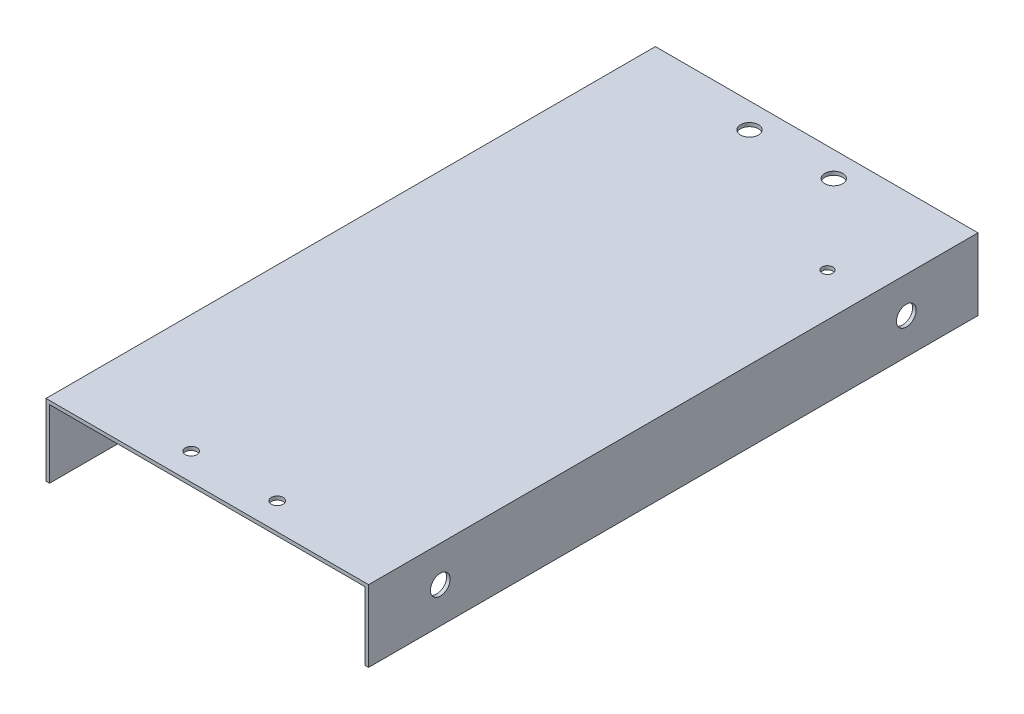
ISO-10303-21;
HEADER;
FILE_DESCRIPTION(('STEP AP214'),'2;1');
FILE_NAME('part.step','',(''),(''),'','','');
FILE_SCHEMA(('AUTOMOTIVE_DESIGN { 1 0 10303 214 1 1 1 1 }'));
ENDSEC;
DATA;
#1=APPLICATION_CONTEXT('core data for automotive mechanical design processes');
#2=APPLICATION_PROTOCOL_DEFINITION('international standard','automotive_design',2000,#1);
#3=PRODUCT_CONTEXT('',#1,'mechanical');
#4=PRODUCT('Part','Part','',(#3));
#5=PRODUCT_RELATED_PRODUCT_CATEGORY('part','',(#4));
#6=PRODUCT_DEFINITION_FORMATION('','',#4);
#7=PRODUCT_DEFINITION_CONTEXT('part definition',#1,'design');
#8=PRODUCT_DEFINITION('design','',#6,#7);
#9=PRODUCT_DEFINITION_SHAPE('','',#8);
#10=(LENGTH_UNIT() NAMED_UNIT(*) SI_UNIT(.MILLI.,.METRE.));
#11=(NAMED_UNIT(*) PLANE_ANGLE_UNIT() SI_UNIT($,.RADIAN.));
#12=(NAMED_UNIT(*) SI_UNIT($,.STERADIAN.) SOLID_ANGLE_UNIT());
#13=UNCERTAINTY_MEASURE_WITH_UNIT(LENGTH_MEASURE(1.E-05),#10,'distance_accuracy_value','');
#14=(GEOMETRIC_REPRESENTATION_CONTEXT(3) GLOBAL_UNCERTAINTY_ASSIGNED_CONTEXT((#13)) GLOBAL_UNIT_ASSIGNED_CONTEXT((#10,
#11,#12)) REPRESENTATION_CONTEXT('',''));
#15=CARTESIAN_POINT('',(0.,0.,0.));
#16=DIRECTION('',(0.,0.,1.));
#17=DIRECTION('',(1.,0.,0.));
#18=AXIS2_PLACEMENT_3D('',#15,#16,#17);
#19=CARTESIAN_POINT('',(-44.,0.999999999999997,-170.));
#20=DIRECTION('',(0.,-1.,0.));
#21=DIRECTION('',(0.,0.,-1.));
#22=AXIS2_PLACEMENT_3D('',#19,#20,#21);
#23=PLANE('',#22);
#24=DIRECTION('',(1.,0.,0.));
#25=VECTOR('',#24,1.);
#26=CARTESIAN_POINT('',(-44.,0.999999999999997,0.));
#27=LINE('',#26,#25);
#28=CARTESIAN_POINT('',(-45.,0.999999999999997,0.));
#29=VERTEX_POINT('',#28);
#30=CARTESIAN_POINT('',(-44.,0.999999999999997,0.));
#31=VERTEX_POINT('',#30);
#32=EDGE_CURVE('E136',#29,#31,#27,.T.);
#33=ORIENTED_EDGE('',*,*,#32,.F.);
#34=DIRECTION('',(0.,0.,1.));
#35=VECTOR('',#34,1.);
#36=CARTESIAN_POINT('',(-45.,0.999999999999997,-170.));
#37=LINE('',#36,#35);
#38=CARTESIAN_POINT('',(-45.,0.999999999999997,-170.));
#39=VERTEX_POINT('',#38);
#40=EDGE_CURVE('E11',#39,#29,#37,.T.);
#41=ORIENTED_EDGE('',*,*,#40,.F.);
#42=DIRECTION('',(1.,0.,0.));
#43=VECTOR('',#42,1.);
#44=CARTESIAN_POINT('',(-44.,0.999999999999997,-170.));
#45=LINE('',#44,#43);
#46=CARTESIAN_POINT('',(-44.,0.999999999999997,-170.));
#47=VERTEX_POINT('',#46);
#48=EDGE_CURVE('E157',#39,#47,#45,.T.);
#49=ORIENTED_EDGE('',*,*,#48,.T.);
#50=DIRECTION('',(0.,0.,1.));
#51=VECTOR('',#50,1.);
#52=CARTESIAN_POINT('',(-44.,0.999999999999997,-170.));
#53=LINE('',#52,#51);
#54=EDGE_CURVE('E94',#47,#31,#53,.T.);
#55=ORIENTED_EDGE('',*,*,#54,.T.);
#56=EDGE_LOOP('',(#33,#41,#49,#55));
#57=FACE_BOUND('',#56,.T.);
#58=ADVANCED_FACE('F38',(#57),#23,.T.);
#59=CARTESIAN_POINT('',(-45.,0.999999999999997,-170.));
#60=DIRECTION('',(-1.,0.,0.));
#61=DIRECTION('',(0.,0.,1.));
#62=AXIS2_PLACEMENT_3D('',#59,#60,#61);
#63=PLANE('',#62);
#64=CARTESIAN_POINT('',(-45.,11.,-150.));
#65=DIRECTION('',(-1.,0.,0.));
#66=DIRECTION('',(0.,0.,1.));
#67=AXIS2_PLACEMENT_3D('',#64,#65,#66);
#68=CIRCLE('',#67,2.75000000000001);
#69=CARTESIAN_POINT('',(-45.,11.,-147.25));
#70=VERTEX_POINT('',#69);
#71=EDGE_CURVE('E196',#70,#70,#68,.T.);
#72=ORIENTED_EDGE('',*,*,#71,.F.);
#73=EDGE_LOOP('',(#72));
#74=FACE_BOUND('',#73,.T.);
#75=CARTESIAN_POINT('',(-45.,11.,-20.));
#76=DIRECTION('',(-1.,0.,0.));
#77=DIRECTION('',(0.,0.,1.));
#78=AXIS2_PLACEMENT_3D('',#75,#76,#77);
#79=CIRCLE('',#78,2.75);
#80=CARTESIAN_POINT('',(-45.,11.,-17.25));
#81=VERTEX_POINT('',#80);
#82=EDGE_CURVE('E181',#81,#81,#79,.T.);
#83=ORIENTED_EDGE('',*,*,#82,.F.);
#84=EDGE_LOOP('',(#83));
#85=FACE_BOUND('',#84,.T.);
#86=DIRECTION('',(0.,-1.,0.));
#87=VECTOR('',#86,1.);
#88=CARTESIAN_POINT('',(-45.,0.999999999999997,0.));
#89=LINE('',#88,#87);
#90=CARTESIAN_POINT('',(-45.,21.,0.));
#91=VERTEX_POINT('',#90);
#92=EDGE_CURVE('E155',#91,#29,#89,.T.);
#93=ORIENTED_EDGE('',*,*,#92,.F.);
#94=DIRECTION('',(0.,0.,1.));
#95=VECTOR('',#94,1.);
#96=CARTESIAN_POINT('',(-45.,21.,-170.));
#97=LINE('',#96,#95);
#98=CARTESIAN_POINT('',(-45.,21.,-170.));
#99=VERTEX_POINT('',#98);
#100=EDGE_CURVE('E47',#99,#91,#97,.T.);
#101=ORIENTED_EDGE('',*,*,#100,.F.);
#102=DIRECTION('',(0.,-1.,0.));
#103=VECTOR('',#102,1.);
#104=CARTESIAN_POINT('',(-45.,0.999999999999997,-170.));
#105=LINE('',#104,#103);
#106=EDGE_CURVE('E126',#99,#39,#105,.T.);
#107=ORIENTED_EDGE('',*,*,#106,.T.);
#108=ORIENTED_EDGE('',*,*,#40,.T.);
#109=EDGE_LOOP('',(#93,#101,#107,#108));
#110=FACE_BOUND('',#109,.T.);
#111=ADVANCED_FACE('F226',(#74,#85,#110),#63,.T.);
#112=CARTESIAN_POINT('',(-45.,21.,-170.));
#113=DIRECTION('',(0.,1.,0.));
#114=DIRECTION('',(0.,0.,1.));
#115=AXIS2_PLACEMENT_3D('',#112,#113,#114);
#116=PLANE('',#115);
#117=CARTESIAN_POINT('',(33.,21.,-140.));
#118=DIRECTION('',(0.,1.,0.));
#119=DIRECTION('',(0.,0.,1.));
#120=AXIS2_PLACEMENT_3D('',#117,#118,#119);
#121=CIRCLE('',#120,1.5);
#122=CARTESIAN_POINT('',(33.,21.,-138.5));
#123=VERTEX_POINT('',#122);
#124=EDGE_CURVE('E317',#123,#123,#121,.T.);
#125=ORIENTED_EDGE('',*,*,#124,.F.);
#126=EDGE_LOOP('',(#125));
#127=FACE_BOUND('',#126,.T.);
#128=CARTESIAN_POINT('',(-11.75,21.,-163.));
#129=DIRECTION('',(0.,1.,0.));
#130=DIRECTION('',(0.,0.,1.));
#131=AXIS2_PLACEMENT_3D('',#128,#129,#130);
#132=CIRCLE('',#131,2.5);
#133=CARTESIAN_POINT('',(-11.75,21.,-160.5));
#134=VERTEX_POINT('',#133);
#135=EDGE_CURVE('E188',#134,#134,#132,.T.);
#136=ORIENTED_EDGE('',*,*,#135,.F.);
#137=EDGE_LOOP('',(#136));
#138=FACE_BOUND('',#137,.T.);
#139=CARTESIAN_POINT('',(11.75,21.,-163.));
#140=DIRECTION('',(0.,1.,0.));
#141=DIRECTION('',(0.,0.,-1.));
#142=AXIS2_PLACEMENT_3D('',#139,#140,#141);
#143=CIRCLE('',#142,2.5);
#144=CARTESIAN_POINT('',(11.75,21.,-165.5));
#145=VERTEX_POINT('',#144);
#146=EDGE_CURVE('E320',#145,#145,#143,.T.);
#147=ORIENTED_EDGE('',*,*,#146,.F.);
#148=EDGE_LOOP('',(#147));
#149=FACE_BOUND('',#148,.T.);
#150=CARTESIAN_POINT('',(12.,21.,-7.5));
#151=DIRECTION('',(0.,1.,0.));
#152=DIRECTION('',(0.,0.,1.));
#153=AXIS2_PLACEMENT_3D('',#150,#151,#152);
#154=CIRCLE('',#153,1.65);
#155=CARTESIAN_POINT('',(12.,21.,-5.85));
#156=VERTEX_POINT('',#155);
#157=EDGE_CURVE('E177',#156,#156,#154,.T.);
#158=ORIENTED_EDGE('',*,*,#157,.F.);
#159=EDGE_LOOP('',(#158));
#160=FACE_BOUND('',#159,.T.);
#161=CARTESIAN_POINT('',(-12.,21.,-7.5));
#162=DIRECTION('',(0.,1.,0.));
#163=DIRECTION('',(0.,0.,-1.));
#164=AXIS2_PLACEMENT_3D('',#161,#162,#163);
#165=CIRCLE('',#164,1.65);
#166=CARTESIAN_POINT('',(-12.,21.,-9.15));
#167=VERTEX_POINT('',#166);
#168=EDGE_CURVE('E183',#167,#167,#165,.T.);
#169=ORIENTED_EDGE('',*,*,#168,.F.);
#170=EDGE_LOOP('',(#169));
#171=FACE_BOUND('',#170,.T.);
#172=DIRECTION('',(-1.,0.,0.));
#173=VECTOR('',#172,1.);
#174=CARTESIAN_POINT('',(-45.,21.,0.));
#175=LINE('',#174,#173);
#176=CARTESIAN_POINT('',(45.,21.,0.));
#177=VERTEX_POINT('',#176);
#178=EDGE_CURVE('E113',#177,#91,#175,.T.);
#179=ORIENTED_EDGE('',*,*,#178,.F.);
#180=DIRECTION('',(0.,0.,1.));
#181=VECTOR('',#180,1.);
#182=CARTESIAN_POINT('',(45.,21.,-170.));
#183=LINE('',#182,#181);
#184=CARTESIAN_POINT('',(45.,21.,-170.));
#185=VERTEX_POINT('',#184);
#186=EDGE_CURVE('E108',#185,#177,#183,.T.);
#187=ORIENTED_EDGE('',*,*,#186,.F.);
#188=DIRECTION('',(-1.,0.,0.));
#189=VECTOR('',#188,1.);
#190=CARTESIAN_POINT('',(-45.,21.,-170.));
#191=LINE('',#190,#189);
#192=EDGE_CURVE('E111',#185,#99,#191,.T.);
#193=ORIENTED_EDGE('',*,*,#192,.T.);
#194=ORIENTED_EDGE('',*,*,#100,.T.);
#195=EDGE_LOOP('',(#179,#187,#193,#194));
#196=FACE_BOUND('',#195,.T.);
#197=ADVANCED_FACE('F110',(#127,#138,#149,#160,#171,#196),#116,.T.);
#198=CARTESIAN_POINT('',(45.,21.,-170.));
#199=DIRECTION('',(1.,0.,0.));
#200=DIRECTION('',(0.,1.,0.));
#201=AXIS2_PLACEMENT_3D('',#198,#199,#200);
#202=PLANE('',#201);
#203=CARTESIAN_POINT('',(45.,11.,-150.));
#204=DIRECTION('',(-1.,0.,0.));
#205=DIRECTION('',(0.,0.,1.));
#206=AXIS2_PLACEMENT_3D('',#203,#204,#205);
#207=CIRCLE('',#206,2.75000000000001);
#208=CARTESIAN_POINT('',(45.,11.,-147.25));
#209=VERTEX_POINT('',#208);
#210=EDGE_CURVE('E172',#209,#209,#207,.T.);
#211=ORIENTED_EDGE('',*,*,#210,.T.);
#212=EDGE_LOOP('',(#211));
#213=FACE_BOUND('',#212,.T.);
#214=CARTESIAN_POINT('',(45.,11.,-20.));
#215=DIRECTION('',(-1.,0.,0.));
#216=DIRECTION('',(0.,0.,1.));
#217=AXIS2_PLACEMENT_3D('',#214,#215,#216);
#218=CIRCLE('',#217,2.75);
#219=CARTESIAN_POINT('',(45.,11.,-17.25));
#220=VERTEX_POINT('',#219);
#221=EDGE_CURVE('E199',#220,#220,#218,.T.);
#222=ORIENTED_EDGE('',*,*,#221,.T.);
#223=EDGE_LOOP('',(#222));
#224=FACE_BOUND('',#223,.T.);
#225=DIRECTION('',(0.,1.,0.));
#226=VECTOR('',#225,1.);
#227=CARTESIAN_POINT('',(45.,21.,0.));
#228=LINE('',#227,#226);
#229=CARTESIAN_POINT('',(45.,0.999999999999997,0.));
#230=VERTEX_POINT('',#229);
#231=EDGE_CURVE('E152',#230,#177,#228,.T.);
#232=ORIENTED_EDGE('',*,*,#231,.F.);
#233=DIRECTION('',(0.,0.,1.));
#234=VECTOR('',#233,1.);
#235=CARTESIAN_POINT('',(45.,0.999999999999997,-170.));
#236=LINE('',#235,#234);
#237=CARTESIAN_POINT('',(45.,0.999999999999997,-170.));
#238=VERTEX_POINT('',#237);
#239=EDGE_CURVE('E118',#238,#230,#236,.T.);
#240=ORIENTED_EDGE('',*,*,#239,.F.);
#241=DIRECTION('',(0.,1.,0.));
#242=VECTOR('',#241,1.);
#243=CARTESIAN_POINT('',(45.,21.,-170.));
#244=LINE('',#243,#242);
#245=EDGE_CURVE('E124',#238,#185,#244,.T.);
#246=ORIENTED_EDGE('',*,*,#245,.T.);
#247=ORIENTED_EDGE('',*,*,#186,.T.);
#248=EDGE_LOOP('',(#232,#240,#246,#247));
#249=FACE_BOUND('',#248,.T.);
#250=ADVANCED_FACE('F128',(#213,#224,#249),#202,.T.);
#251=CARTESIAN_POINT('',(45.,0.999999999999997,-170.));
#252=DIRECTION('',(0.,-1.,0.));
#253=DIRECTION('',(1.,0.,0.));
#254=AXIS2_PLACEMENT_3D('',#251,#252,#253);
#255=PLANE('',#254);
#256=DIRECTION('',(1.,0.,0.));
#257=VECTOR('',#256,1.);
#258=CARTESIAN_POINT('',(45.,0.999999999999997,0.));
#259=LINE('',#258,#257);
#260=CARTESIAN_POINT('',(44.,0.999999999999997,0.));
#261=VERTEX_POINT('',#260);
#262=EDGE_CURVE('E149',#261,#230,#259,.T.);
#263=ORIENTED_EDGE('',*,*,#262,.F.);
#264=DIRECTION('',(0.,0.,1.));
#265=VECTOR('',#264,1.);
#266=CARTESIAN_POINT('',(44.,0.999999999999997,-170.));
#267=LINE('',#266,#265);
#268=CARTESIAN_POINT('',(44.,0.999999999999997,-170.));
#269=VERTEX_POINT('',#268);
#270=EDGE_CURVE('E161',#269,#261,#267,.T.);
#271=ORIENTED_EDGE('',*,*,#270,.F.);
#272=DIRECTION('',(1.,0.,0.));
#273=VECTOR('',#272,1.);
#274=CARTESIAN_POINT('',(45.,0.999999999999997,-170.));
#275=LINE('',#274,#273);
#276=EDGE_CURVE('E129',#269,#238,#275,.T.);
#277=ORIENTED_EDGE('',*,*,#276,.T.);
#278=ORIENTED_EDGE('',*,*,#239,.T.);
#279=EDGE_LOOP('',(#263,#271,#277,#278));
#280=FACE_BOUND('',#279,.T.);
#281=ADVANCED_FACE('F243',(#280),#255,.T.);
#282=CARTESIAN_POINT('',(44.,0.999999999999997,-170.));
#283=DIRECTION('',(-1.,0.,0.));
#284=DIRECTION('',(0.,0.,1.));
#285=AXIS2_PLACEMENT_3D('',#282,#283,#284);
#286=PLANE('',#285);
#287=CARTESIAN_POINT('',(44.,11.,-150.));
#288=DIRECTION('',(-1.,0.,0.));
#289=DIRECTION('',(0.,0.,1.));
#290=AXIS2_PLACEMENT_3D('',#287,#288,#289);
#291=CIRCLE('',#290,2.75000000000001);
#292=CARTESIAN_POINT('',(44.,11.,-147.25));
#293=VERTEX_POINT('',#292);
#294=EDGE_CURVE('E140',#293,#293,#291,.T.);
#295=ORIENTED_EDGE('',*,*,#294,.F.);
#296=EDGE_LOOP('',(#295));
#297=FACE_BOUND('',#296,.T.);
#298=CARTESIAN_POINT('',(44.,11.,-20.));
#299=DIRECTION('',(-1.,0.,0.));
#300=DIRECTION('',(0.,0.,1.));
#301=AXIS2_PLACEMENT_3D('',#298,#299,#300);
#302=CIRCLE('',#301,2.75);
#303=CARTESIAN_POINT('',(44.,11.,-17.25));
#304=VERTEX_POINT('',#303);
#305=EDGE_CURVE('E171',#304,#304,#302,.T.);
#306=ORIENTED_EDGE('',*,*,#305,.F.);
#307=EDGE_LOOP('',(#306));
#308=FACE_BOUND('',#307,.T.);
#309=DIRECTION('',(0.,-1.,0.));
#310=VECTOR('',#309,1.);
#311=CARTESIAN_POINT('',(44.,0.999999999999997,0.));
#312=LINE('',#311,#310);
#313=CARTESIAN_POINT('',(44.,20.,0.));
#314=VERTEX_POINT('',#313);
#315=EDGE_CURVE('E146',#314,#261,#312,.T.);
#316=ORIENTED_EDGE('',*,*,#315,.F.);
#317=DIRECTION('',(0.,0.,1.));
#318=VECTOR('',#317,1.);
#319=CARTESIAN_POINT('',(44.,20.,-170.));
#320=LINE('',#319,#318);
#321=CARTESIAN_POINT('',(44.,20.,-170.));
#322=VERTEX_POINT('',#321);
#323=EDGE_CURVE('E163',#322,#314,#320,.T.);
#324=ORIENTED_EDGE('',*,*,#323,.F.);
#325=DIRECTION('',(0.,-1.,0.));
#326=VECTOR('',#325,1.);
#327=CARTESIAN_POINT('',(44.,0.999999999999997,-170.));
#328=LINE('',#327,#326);
#329=EDGE_CURVE('E131',#322,#269,#328,.T.);
#330=ORIENTED_EDGE('',*,*,#329,.T.);
#331=ORIENTED_EDGE('',*,*,#270,.T.);
#332=EDGE_LOOP('',(#316,#324,#330,#331));
#333=FACE_BOUND('',#332,.T.);
#334=ADVANCED_FACE('F217',(#297,#308,#333),#286,.T.);
#335=CARTESIAN_POINT('',(44.,20.,-170.));
#336=DIRECTION('',(0.,-1.,0.));
#337=DIRECTION('',(1.,0.,0.));
#338=AXIS2_PLACEMENT_3D('',#335,#336,#337);
#339=PLANE('',#338);
#340=CARTESIAN_POINT('',(33.,20.,-140.));
#341=DIRECTION('',(0.,-1.,0.));
#342=DIRECTION('',(1.,0.,0.));
#343=AXIS2_PLACEMENT_3D('',#340,#341,#342);
#344=CIRCLE('',#343,1.5);
#345=CARTESIAN_POINT('',(34.5,20.,-140.));
#346=VERTEX_POINT('',#345);
#347=EDGE_CURVE('E314',#346,#346,#344,.F.);
#348=ORIENTED_EDGE('',*,*,#347,.T.);
#349=EDGE_LOOP('',(#348));
#350=FACE_BOUND('',#349,.T.);
#351=CARTESIAN_POINT('',(-11.75,20.,-163.));
#352=DIRECTION('',(0.,-1.,0.));
#353=DIRECTION('',(1.,0.,0.));
#354=AXIS2_PLACEMENT_3D('',#351,#352,#353);
#355=CIRCLE('',#354,2.5);
#356=CARTESIAN_POINT('',(-9.25,20.,-163.));
#357=VERTEX_POINT('',#356);
#358=EDGE_CURVE('E325',#357,#357,#355,.F.);
#359=ORIENTED_EDGE('',*,*,#358,.T.);
#360=EDGE_LOOP('',(#359));
#361=FACE_BOUND('',#360,.T.);
#362=CARTESIAN_POINT('',(11.75,20.,-163.));
#363=DIRECTION('',(0.,-1.,0.));
#364=DIRECTION('',(1.,0.,0.));
#365=AXIS2_PLACEMENT_3D('',#362,#363,#364);
#366=CIRCLE('',#365,2.5);
#367=CARTESIAN_POINT('',(14.25,20.,-163.));
#368=VERTEX_POINT('',#367);
#369=EDGE_CURVE('E191',#368,#368,#366,.F.);
#370=ORIENTED_EDGE('',*,*,#369,.T.);
#371=EDGE_LOOP('',(#370));
#372=FACE_BOUND('',#371,.T.);
#373=CARTESIAN_POINT('',(12.,20.,-7.5));
#374=DIRECTION('',(0.,-1.,0.));
#375=DIRECTION('',(1.,0.,0.));
#376=AXIS2_PLACEMENT_3D('',#373,#374,#375);
#377=CIRCLE('',#376,1.65);
#378=CARTESIAN_POINT('',(13.65,20.,-7.5));
#379=VERTEX_POINT('',#378);
#380=EDGE_CURVE('E41',#379,#379,#377,.T.);
#381=ORIENTED_EDGE('',*,*,#380,.F.);
#382=EDGE_LOOP('',(#381));
#383=FACE_BOUND('',#382,.T.);
#384=CARTESIAN_POINT('',(-12.,20.,-7.5));
#385=DIRECTION('',(0.,-1.,0.));
#386=DIRECTION('',(1.,0.,0.));
#387=AXIS2_PLACEMENT_3D('',#384,#385,#386);
#388=CIRCLE('',#387,1.65);
#389=CARTESIAN_POINT('',(-10.35,20.,-7.5));
#390=VERTEX_POINT('',#389);
#391=EDGE_CURVE('E175',#390,#390,#388,.T.);
#392=ORIENTED_EDGE('',*,*,#391,.F.);
#393=EDGE_LOOP('',(#392));
#394=FACE_BOUND('',#393,.T.);
#395=DIRECTION('',(1.,0.,0.));
#396=VECTOR('',#395,1.);
#397=CARTESIAN_POINT('',(44.,20.,0.));
#398=LINE('',#397,#396);
#399=CARTESIAN_POINT('',(-44.,20.,0.));
#400=VERTEX_POINT('',#399);
#401=EDGE_CURVE('E143',#400,#314,#398,.T.);
#402=ORIENTED_EDGE('',*,*,#401,.F.);
#403=DIRECTION('',(0.,0.,1.));
#404=VECTOR('',#403,1.);
#405=CARTESIAN_POINT('',(-44.,20.,-170.));
#406=LINE('',#405,#404);
#407=CARTESIAN_POINT('',(-44.,20.,-170.));
#408=VERTEX_POINT('',#407);
#409=EDGE_CURVE('E165',#408,#400,#406,.T.);
#410=ORIENTED_EDGE('',*,*,#409,.F.);
#411=DIRECTION('',(1.,0.,0.));
#412=VECTOR('',#411,1.);
#413=CARTESIAN_POINT('',(44.,20.,-170.));
#414=LINE('',#413,#412);
#415=EDGE_CURVE('E211',#408,#322,#414,.T.);
#416=ORIENTED_EDGE('',*,*,#415,.T.);
#417=ORIENTED_EDGE('',*,*,#323,.T.);
#418=EDGE_LOOP('',(#402,#410,#416,#417));
#419=FACE_BOUND('',#418,.T.);
#420=ADVANCED_FACE('F222',(#350,#361,#372,#383,#394,#419),#339,.T.);
#421=CARTESIAN_POINT('',(-44.,20.,-170.));
#422=DIRECTION('',(1.,0.,0.));
#423=DIRECTION('',(0.,0.,-1.));
#424=AXIS2_PLACEMENT_3D('',#421,#422,#423);
#425=PLANE('',#424);
#426=CARTESIAN_POINT('',(-44.,11.,-150.));
#427=DIRECTION('',(1.,0.,0.));
#428=DIRECTION('',(0.,0.,-1.));
#429=AXIS2_PLACEMENT_3D('',#426,#427,#428);
#430=CIRCLE('',#429,2.75000000000001);
#431=CARTESIAN_POINT('',(-44.,11.,-147.25));
#432=VERTEX_POINT('',#431);
#433=EDGE_CURVE('E173',#432,#432,#430,.T.);
#434=ORIENTED_EDGE('',*,*,#433,.F.);
#435=EDGE_LOOP('',(#434));
#436=FACE_BOUND('',#435,.T.);
#437=CARTESIAN_POINT('',(-44.,11.,-20.));
#438=DIRECTION('',(1.,0.,0.));
#439=DIRECTION('',(0.,0.,-1.));
#440=AXIS2_PLACEMENT_3D('',#437,#438,#439);
#441=CIRCLE('',#440,2.75);
#442=CARTESIAN_POINT('',(-44.,11.,-17.25));
#443=VERTEX_POINT('',#442);
#444=EDGE_CURVE('E168',#443,#443,#441,.T.);
#445=ORIENTED_EDGE('',*,*,#444,.F.);
#446=EDGE_LOOP('',(#445));
#447=FACE_BOUND('',#446,.T.);
#448=DIRECTION('',(0.,1.,0.));
#449=VECTOR('',#448,1.);
#450=CARTESIAN_POINT('',(-44.,20.,0.));
#451=LINE('',#450,#449);
#452=EDGE_CURVE('E139',#31,#400,#451,.T.);
#453=ORIENTED_EDGE('',*,*,#452,.F.);
#454=ORIENTED_EDGE('',*,*,#54,.F.);
#455=DIRECTION('',(0.,1.,0.));
#456=VECTOR('',#455,1.);
#457=CARTESIAN_POINT('',(-44.,20.,-170.));
#458=LINE('',#457,#456);
#459=EDGE_CURVE('E209',#47,#408,#458,.T.);
#460=ORIENTED_EDGE('',*,*,#459,.T.);
#461=ORIENTED_EDGE('',*,*,#409,.T.);
#462=EDGE_LOOP('',(#453,#454,#460,#461));
#463=FACE_BOUND('',#462,.T.);
#464=ADVANCED_FACE('F223',(#436,#447,#463),#425,.T.);
#465=CARTESIAN_POINT('',(0.,0.,-170.));
#466=DIRECTION('',(0.,0.,-1.));
#467=DIRECTION('',(-1.,0.,0.));
#468=AXIS2_PLACEMENT_3D('',#465,#466,#467);
#469=PLANE('',#468);
#470=ORIENTED_EDGE('',*,*,#48,.F.);
#471=ORIENTED_EDGE('',*,*,#106,.F.);
#472=ORIENTED_EDGE('',*,*,#192,.F.);
#473=ORIENTED_EDGE('',*,*,#245,.F.);
#474=ORIENTED_EDGE('',*,*,#276,.F.);
#475=ORIENTED_EDGE('',*,*,#329,.F.);
#476=ORIENTED_EDGE('',*,*,#415,.F.);
#477=ORIENTED_EDGE('',*,*,#459,.F.);
#478=EDGE_LOOP('',(#470,#471,#472,#473,#474,#475,#476,#477));
#479=FACE_BOUND('',#478,.T.);
#480=ADVANCED_FACE('F122',(#479),#469,.T.);
#481=CARTESIAN_POINT('',(0.,0.,0.));
#482=DIRECTION('',(0.,0.,-1.));
#483=DIRECTION('',(-1.,0.,0.));
#484=AXIS2_PLACEMENT_3D('',#481,#482,#483);
#485=PLANE('',#484);
#486=ORIENTED_EDGE('',*,*,#32,.T.);
#487=ORIENTED_EDGE('',*,*,#452,.T.);
#488=ORIENTED_EDGE('',*,*,#401,.T.);
#489=ORIENTED_EDGE('',*,*,#315,.T.);
#490=ORIENTED_EDGE('',*,*,#262,.T.);
#491=ORIENTED_EDGE('',*,*,#231,.T.);
#492=ORIENTED_EDGE('',*,*,#178,.T.);
#493=ORIENTED_EDGE('',*,*,#92,.T.);
#494=EDGE_LOOP('',(#486,#487,#488,#489,#490,#491,#492,#493));
#495=FACE_BOUND('',#494,.T.);
#496=ADVANCED_FACE('F225',(#495),#485,.F.);
#497=CARTESIAN_POINT('',(45.,11.,-20.));
#498=DIRECTION('',(-1.,0.,0.));
#499=DIRECTION('',(0.,0.,1.));
#500=AXIS2_PLACEMENT_3D('',#497,#498,#499);
#501=CYLINDRICAL_SURFACE('',#500,2.75);
#502=CARTESIAN_POINT('',(-44.,11.,-17.25));
#503=CARTESIAN_POINT('',(-44.0104166666667,11.,-17.25));
#504=CARTESIAN_POINT('',(-44.0208333333333,11.,-17.25));
#505=CARTESIAN_POINT('',(-44.0416666666667,11.,-17.25));
#506=CARTESIAN_POINT('',(-44.0520833333333,11.,-17.25));
#507=CARTESIAN_POINT('',(-44.0729166666667,11.,-17.25));
#508=CARTESIAN_POINT('',(-44.0833333333333,11.,-17.25));
#509=CARTESIAN_POINT('',(-44.1041666666667,11.,-17.25));
#510=CARTESIAN_POINT('',(-44.1145833333333,11.,-17.25));
#511=CARTESIAN_POINT('',(-44.1354166666667,11.,-17.25));
#512=CARTESIAN_POINT('',(-44.1458333333333,11.,-17.25));
#513=CARTESIAN_POINT('',(-44.1666666666667,11.,-17.25));
#514=CARTESIAN_POINT('',(-44.1770833333333,11.,-17.25));
#515=CARTESIAN_POINT('',(-44.1979166666667,11.,-17.25));
#516=CARTESIAN_POINT('',(-44.2083333333333,11.,-17.25));
#517=CARTESIAN_POINT('',(-44.2291666666667,11.,-17.25));
#518=CARTESIAN_POINT('',(-44.2395833333333,11.,-17.25));
#519=CARTESIAN_POINT('',(-44.2604166666667,11.,-17.25));
#520=CARTESIAN_POINT('',(-44.2708333333333,11.,-17.25));
#521=CARTESIAN_POINT('',(-44.2916666666667,11.,-17.25));
#522=CARTESIAN_POINT('',(-44.3020833333333,11.,-17.25));
#523=CARTESIAN_POINT('',(-44.3229166666667,11.,-17.25));
#524=CARTESIAN_POINT('',(-44.3333333333333,11.,-17.25));
#525=CARTESIAN_POINT('',(-44.3541666666667,11.,-17.25));
#526=CARTESIAN_POINT('',(-44.3645833333333,11.,-17.25));
#527=CARTESIAN_POINT('',(-44.3854166666667,11.,-17.25));
#528=CARTESIAN_POINT('',(-44.3958333333333,11.,-17.25));
#529=CARTESIAN_POINT('',(-44.4166666666667,11.,-17.25));
#530=CARTESIAN_POINT('',(-44.4270833333333,11.,-17.25));
#531=CARTESIAN_POINT('',(-44.4479166666667,11.,-17.25));
#532=CARTESIAN_POINT('',(-44.4583333333333,11.,-17.25));
#533=CARTESIAN_POINT('',(-44.4791666666667,11.,-17.25));
#534=CARTESIAN_POINT('',(-44.4895833333333,11.,-17.25));
#535=CARTESIAN_POINT('',(-44.5104166666667,11.,-17.25));
#536=CARTESIAN_POINT('',(-44.5208333333333,11.,-17.25));
#537=CARTESIAN_POINT('',(-44.5416666666667,11.,-17.25));
#538=CARTESIAN_POINT('',(-44.5520833333333,11.,-17.25));
#539=CARTESIAN_POINT('',(-44.5729166666667,11.,-17.25));
#540=CARTESIAN_POINT('',(-44.5833333333333,11.,-17.25));
#541=CARTESIAN_POINT('',(-44.6041666666667,11.,-17.25));
#542=CARTESIAN_POINT('',(-44.6145833333333,11.,-17.25));
#543=CARTESIAN_POINT('',(-44.6354166666667,11.,-17.25));
#544=CARTESIAN_POINT('',(-44.6458333333333,11.,-17.25));
#545=CARTESIAN_POINT('',(-44.6666666666667,11.,-17.25));
#546=CARTESIAN_POINT('',(-44.6770833333333,11.,-17.25));
#547=CARTESIAN_POINT('',(-44.6979166666667,11.,-17.25));
#548=CARTESIAN_POINT('',(-44.7083333333333,11.,-17.25));
#549=CARTESIAN_POINT('',(-44.7291666666667,11.,-17.25));
#550=CARTESIAN_POINT('',(-44.7395833333333,11.,-17.25));
#551=CARTESIAN_POINT('',(-44.7604166666667,11.,-17.25));
#552=CARTESIAN_POINT('',(-44.7708333333333,11.,-17.25));
#553=CARTESIAN_POINT('',(-44.7916666666667,11.,-17.25));
#554=CARTESIAN_POINT('',(-44.8020833333333,11.,-17.25));
#555=CARTESIAN_POINT('',(-44.8229166666667,11.,-17.25));
#556=CARTESIAN_POINT('',(-44.8333333333333,11.,-17.25));
#557=CARTESIAN_POINT('',(-44.8541666666667,11.,-17.25));
#558=CARTESIAN_POINT('',(-44.8645833333333,11.,-17.25));
#559=CARTESIAN_POINT('',(-44.8854166666667,11.,-17.25));
#560=CARTESIAN_POINT('',(-44.8958333333333,11.,-17.25));
#561=CARTESIAN_POINT('',(-44.9166666666667,11.,-17.25));
#562=CARTESIAN_POINT('',(-44.9270833333333,11.,-17.25));
#563=CARTESIAN_POINT('',(-44.9479166666667,11.,-17.25));
#564=CARTESIAN_POINT('',(-44.9583333333333,11.,-17.25));
#565=CARTESIAN_POINT('',(-44.9791666666667,11.,-17.25));
#566=CARTESIAN_POINT('',(-44.9895833333333,11.,-17.25));
#567=CARTESIAN_POINT('',(-45.,11.,-17.25));
#568=B_SPLINE_CURVE_WITH_KNOTS('',3,(#502,#503,#504,#505,#506,#507,#508,#509,#510,#511,#512,
#513,#514,#515,#516,#517,#518,#519,#520,#521,#522,#523,#524,#525,#526,#527,#528,#529,#530,#531,
#532,#533,#534,#535,#536,#537,#538,#539,#540,#541,#542,#543,#544,#545,#546,#547,#548,#549,#550,
#551,#552,#553,#554,#555,#556,#557,#558,#559,#560,#561,#562,#563,#564,#565,#566,#567),
.UNSPECIFIED.,.F.,.F.,(4,2,2,2,2,2,2,2,2,2,2,2,2,2,2,2,2,2,2,2,2,2,2,2,2,2,2,2,2,2,2,2,4),(0.,
0.0312499999999966,0.0624999999999931,0.0937500000000036,0.125,0.156249999999997,
0.187499999999993,0.21874999999999,0.25,0.281249999999997,0.312499999999993,0.34374999999999,
0.374999999999986,0.406249999999983,0.437499999999993,0.46874999999999,0.499999999999987,
0.531249999999983,0.56249999999998,0.59374999999999,0.624999999999987,0.656249999999983,
0.68749999999998,0.718749999999976,0.749999999999973,0.781249999999983,0.81249999999998,
0.843749999999976,0.874999999999973,0.90624999999997,0.93749999999998,0.968749999999977,
0.999999999999973),.UNSPECIFIED.);
#569=EDGE_CURVE('BSEAM262',#443,#81,#568,.T.);
#570=ORIENTED_EDGE('',*,*,#444,.T.);
#571=ORIENTED_EDGE('',*,*,#82,.T.);
#572=ORIENTED_EDGE('',*,*,#569,.T.);
#573=ORIENTED_EDGE('',*,*,#569,.F.);
#574=EDGE_LOOP('',(#570,#572,#571,#573));
#575=FACE_BOUND('',#574,.T.);
#576=ADVANCED_FACE('F262',(#575),#501,.F.);
#577=CARTESIAN_POINT('',(45.,11.,-150.));
#578=DIRECTION('',(-1.,0.,0.));
#579=DIRECTION('',(0.,0.,1.));
#580=AXIS2_PLACEMENT_3D('',#577,#578,#579);
#581=CYLINDRICAL_SURFACE('',#580,2.75000000000001);
#582=CARTESIAN_POINT('',(-44.,11.,-147.25));
#583=CARTESIAN_POINT('',(-44.0104166666667,11.,-147.25));
#584=CARTESIAN_POINT('',(-44.0208333333333,11.,-147.25));
#585=CARTESIAN_POINT('',(-44.0416666666667,11.,-147.25));
#586=CARTESIAN_POINT('',(-44.0520833333333,11.,-147.25));
#587=CARTESIAN_POINT('',(-44.0729166666667,11.,-147.25));
#588=CARTESIAN_POINT('',(-44.0833333333333,11.,-147.25));
#589=CARTESIAN_POINT('',(-44.1041666666667,11.,-147.25));
#590=CARTESIAN_POINT('',(-44.1145833333333,11.,-147.25));
#591=CARTESIAN_POINT('',(-44.1354166666667,11.,-147.25));
#592=CARTESIAN_POINT('',(-44.1458333333333,11.,-147.25));
#593=CARTESIAN_POINT('',(-44.1666666666667,11.,-147.25));
#594=CARTESIAN_POINT('',(-44.1770833333333,11.,-147.25));
#595=CARTESIAN_POINT('',(-44.1979166666667,11.,-147.25));
#596=CARTESIAN_POINT('',(-44.2083333333333,11.,-147.25));
#597=CARTESIAN_POINT('',(-44.2291666666667,11.,-147.25));
#598=CARTESIAN_POINT('',(-44.2395833333333,11.,-147.25));
#599=CARTESIAN_POINT('',(-44.2604166666667,11.,-147.25));
#600=CARTESIAN_POINT('',(-44.2708333333333,11.,-147.25));
#601=CARTESIAN_POINT('',(-44.2916666666667,11.,-147.25));
#602=CARTESIAN_POINT('',(-44.3020833333333,11.,-147.25));
#603=CARTESIAN_POINT('',(-44.3229166666667,11.,-147.25));
#604=CARTESIAN_POINT('',(-44.3333333333333,11.,-147.25));
#605=CARTESIAN_POINT('',(-44.3541666666667,11.,-147.25));
#606=CARTESIAN_POINT('',(-44.3645833333333,11.,-147.25));
#607=CARTESIAN_POINT('',(-44.3854166666667,11.,-147.25));
#608=CARTESIAN_POINT('',(-44.3958333333333,11.,-147.25));
#609=CARTESIAN_POINT('',(-44.4166666666667,11.,-147.25));
#610=CARTESIAN_POINT('',(-44.4270833333333,11.,-147.25));
#611=CARTESIAN_POINT('',(-44.4479166666667,11.,-147.25));
#612=CARTESIAN_POINT('',(-44.4583333333333,11.,-147.25));
#613=CARTESIAN_POINT('',(-44.4791666666667,11.,-147.25));
#614=CARTESIAN_POINT('',(-44.4895833333333,11.,-147.25));
#615=CARTESIAN_POINT('',(-44.5104166666667,11.,-147.25));
#616=CARTESIAN_POINT('',(-44.5208333333333,11.,-147.25));
#617=CARTESIAN_POINT('',(-44.5416666666667,11.,-147.25));
#618=CARTESIAN_POINT('',(-44.5520833333333,11.,-147.25));
#619=CARTESIAN_POINT('',(-44.5729166666667,11.,-147.25));
#620=CARTESIAN_POINT('',(-44.5833333333333,11.,-147.25));
#621=CARTESIAN_POINT('',(-44.6041666666667,11.,-147.25));
#622=CARTESIAN_POINT('',(-44.6145833333333,11.,-147.25));
#623=CARTESIAN_POINT('',(-44.6354166666667,11.,-147.25));
#624=CARTESIAN_POINT('',(-44.6458333333333,11.,-147.25));
#625=CARTESIAN_POINT('',(-44.6666666666667,11.,-147.25));
#626=CARTESIAN_POINT('',(-44.6770833333333,11.,-147.25));
#627=CARTESIAN_POINT('',(-44.6979166666667,11.,-147.25));
#628=CARTESIAN_POINT('',(-44.7083333333333,11.,-147.25));
#629=CARTESIAN_POINT('',(-44.7291666666667,11.,-147.25));
#630=CARTESIAN_POINT('',(-44.7395833333333,11.,-147.25));
#631=CARTESIAN_POINT('',(-44.7604166666667,11.,-147.25));
#632=CARTESIAN_POINT('',(-44.7708333333333,11.,-147.25));
#633=CARTESIAN_POINT('',(-44.7916666666667,11.,-147.25));
#634=CARTESIAN_POINT('',(-44.8020833333333,11.,-147.25));
#635=CARTESIAN_POINT('',(-44.8229166666667,11.,-147.25));
#636=CARTESIAN_POINT('',(-44.8333333333333,11.,-147.25));
#637=CARTESIAN_POINT('',(-44.8541666666667,11.,-147.25));
#638=CARTESIAN_POINT('',(-44.8645833333333,11.,-147.25));
#639=CARTESIAN_POINT('',(-44.8854166666667,11.,-147.25));
#640=CARTESIAN_POINT('',(-44.8958333333333,11.,-147.25));
#641=CARTESIAN_POINT('',(-44.9166666666667,11.,-147.25));
#642=CARTESIAN_POINT('',(-44.9270833333333,11.,-147.25));
#643=CARTESIAN_POINT('',(-44.9479166666667,11.,-147.25));
#644=CARTESIAN_POINT('',(-44.9583333333333,11.,-147.25));
#645=CARTESIAN_POINT('',(-44.9791666666667,11.,-147.25));
#646=CARTESIAN_POINT('',(-44.9895833333333,11.,-147.25));
#647=CARTESIAN_POINT('',(-45.,11.,-147.25));
#648=B_SPLINE_CURVE_WITH_KNOTS('',3,(#582,#583,#584,#585,#586,#587,#588,#589,#590,#591,#592,
#593,#594,#595,#596,#597,#598,#599,#600,#601,#602,#603,#604,#605,#606,#607,#608,#609,#610,#611,
#612,#613,#614,#615,#616,#617,#618,#619,#620,#621,#622,#623,#624,#625,#626,#627,#628,#629,#630,
#631,#632,#633,#634,#635,#636,#637,#638,#639,#640,#641,#642,#643,#644,#645,#646,#647),
.UNSPECIFIED.,.F.,.F.,(4,2,2,2,2,2,2,2,2,2,2,2,2,2,2,2,2,2,2,2,2,2,2,2,2,2,2,2,2,2,2,2,4),(0.,
0.0312499999999966,0.0624999999999931,0.0937500000000036,0.125,0.156249999999997,
0.187499999999993,0.21874999999999,0.25,0.281249999999997,0.312499999999993,0.34374999999999,
0.374999999999986,0.406249999999983,0.437499999999993,0.46874999999999,0.499999999999987,
0.531249999999983,0.56249999999998,0.59374999999999,0.624999999999987,0.656249999999983,
0.68749999999998,0.718749999999976,0.749999999999973,0.781249999999983,0.81249999999998,
0.843749999999976,0.874999999999973,0.90624999999997,0.93749999999998,0.968749999999977,
0.999999999999973),.UNSPECIFIED.);
#649=EDGE_CURVE('BSEAM265',#432,#70,#648,.T.);
#650=ORIENTED_EDGE('',*,*,#433,.T.);
#651=ORIENTED_EDGE('',*,*,#71,.T.);
#652=ORIENTED_EDGE('',*,*,#649,.T.);
#653=ORIENTED_EDGE('',*,*,#649,.F.);
#654=EDGE_LOOP('',(#650,#652,#651,#653));
#655=FACE_BOUND('',#654,.T.);
#656=ADVANCED_FACE('F265',(#655),#581,.F.);
#657=CARTESIAN_POINT('',(44.,11.,-17.25));
#658=CARTESIAN_POINT('',(44.0104166666667,11.,-17.25));
#659=CARTESIAN_POINT('',(44.0208333333333,11.,-17.25));
#660=CARTESIAN_POINT('',(44.0416666666667,11.,-17.25));
#661=CARTESIAN_POINT('',(44.0520833333333,11.,-17.25));
#662=CARTESIAN_POINT('',(44.0729166666667,11.,-17.25));
#663=CARTESIAN_POINT('',(44.0833333333333,11.,-17.25));
#664=CARTESIAN_POINT('',(44.1041666666667,11.,-17.25));
#665=CARTESIAN_POINT('',(44.1145833333333,11.,-17.25));
#666=CARTESIAN_POINT('',(44.1354166666667,11.,-17.25));
#667=CARTESIAN_POINT('',(44.1458333333333,11.,-17.25));
#668=CARTESIAN_POINT('',(44.1666666666667,11.,-17.25));
#669=CARTESIAN_POINT('',(44.1770833333333,11.,-17.25));
#670=CARTESIAN_POINT('',(44.1979166666667,11.,-17.25));
#671=CARTESIAN_POINT('',(44.2083333333333,11.,-17.25));
#672=CARTESIAN_POINT('',(44.2291666666667,11.,-17.25));
#673=CARTESIAN_POINT('',(44.2395833333333,11.,-17.25));
#674=CARTESIAN_POINT('',(44.2604166666667,11.,-17.25));
#675=CARTESIAN_POINT('',(44.2708333333333,11.,-17.25));
#676=CARTESIAN_POINT('',(44.2916666666667,11.,-17.25));
#677=CARTESIAN_POINT('',(44.3020833333333,11.,-17.25));
#678=CARTESIAN_POINT('',(44.3229166666667,11.,-17.25));
#679=CARTESIAN_POINT('',(44.3333333333333,11.,-17.25));
#680=CARTESIAN_POINT('',(44.3541666666667,11.,-17.25));
#681=CARTESIAN_POINT('',(44.3645833333333,11.,-17.25));
#682=CARTESIAN_POINT('',(44.3854166666667,11.,-17.25));
#683=CARTESIAN_POINT('',(44.3958333333333,11.,-17.25));
#684=CARTESIAN_POINT('',(44.4166666666667,11.,-17.25));
#685=CARTESIAN_POINT('',(44.4270833333333,11.,-17.25));
#686=CARTESIAN_POINT('',(44.4479166666667,11.,-17.25));
#687=CARTESIAN_POINT('',(44.4583333333333,11.,-17.25));
#688=CARTESIAN_POINT('',(44.4791666666667,11.,-17.25));
#689=CARTESIAN_POINT('',(44.4895833333333,11.,-17.25));
#690=CARTESIAN_POINT('',(44.5104166666667,11.,-17.25));
#691=CARTESIAN_POINT('',(44.5208333333333,11.,-17.25));
#692=CARTESIAN_POINT('',(44.5416666666667,11.,-17.25));
#693=CARTESIAN_POINT('',(44.5520833333333,11.,-17.25));
#694=CARTESIAN_POINT('',(44.5729166666667,11.,-17.25));
#695=CARTESIAN_POINT('',(44.5833333333333,11.,-17.25));
#696=CARTESIAN_POINT('',(44.6041666666667,11.,-17.25));
#697=CARTESIAN_POINT('',(44.6145833333333,11.,-17.25));
#698=CARTESIAN_POINT('',(44.6354166666667,11.,-17.25));
#699=CARTESIAN_POINT('',(44.6458333333333,11.,-17.25));
#700=CARTESIAN_POINT('',(44.6666666666667,11.,-17.25));
#701=CARTESIAN_POINT('',(44.6770833333333,11.,-17.25));
#702=CARTESIAN_POINT('',(44.6979166666667,11.,-17.25));
#703=CARTESIAN_POINT('',(44.7083333333333,11.,-17.25));
#704=CARTESIAN_POINT('',(44.7291666666667,11.,-17.25));
#705=CARTESIAN_POINT('',(44.7395833333333,11.,-17.25));
#706=CARTESIAN_POINT('',(44.7604166666667,11.,-17.25));
#707=CARTESIAN_POINT('',(44.7708333333333,11.,-17.25));
#708=CARTESIAN_POINT('',(44.7916666666667,11.,-17.25));
#709=CARTESIAN_POINT('',(44.8020833333333,11.,-17.25));
#710=CARTESIAN_POINT('',(44.8229166666667,11.,-17.25));
#711=CARTESIAN_POINT('',(44.8333333333333,11.,-17.25));
#712=CARTESIAN_POINT('',(44.8541666666667,11.,-17.25));
#713=CARTESIAN_POINT('',(44.8645833333333,11.,-17.25));
#714=CARTESIAN_POINT('',(44.8854166666667,11.,-17.25));
#715=CARTESIAN_POINT('',(44.8958333333333,11.,-17.25));
#716=CARTESIAN_POINT('',(44.9166666666667,11.,-17.25));
#717=CARTESIAN_POINT('',(44.9270833333333,11.,-17.25));
#718=CARTESIAN_POINT('',(44.9479166666667,11.,-17.25));
#719=CARTESIAN_POINT('',(44.9583333333333,11.,-17.25));
#720=CARTESIAN_POINT('',(44.9791666666667,11.,-17.25));
#721=CARTESIAN_POINT('',(44.9895833333333,11.,-17.25));
#722=CARTESIAN_POINT('',(45.,11.,-17.25));
#723=B_SPLINE_CURVE_WITH_KNOTS('',3,(#657,#658,#659,#660,#661,#662,#663,#664,#665,#666,#667,
#668,#669,#670,#671,#672,#673,#674,#675,#676,#677,#678,#679,#680,#681,#682,#683,#684,#685,#686,
#687,#688,#689,#690,#691,#692,#693,#694,#695,#696,#697,#698,#699,#700,#701,#702,#703,#704,#705,
#706,#707,#708,#709,#710,#711,#712,#713,#714,#715,#716,#717,#718,#719,#720,#721,#722),
.UNSPECIFIED.,.F.,.F.,(4,2,2,2,2,2,2,2,2,2,2,2,2,2,2,2,2,2,2,2,2,2,2,2,2,2,2,2,2,2,2,2,4),(0.,
0.0312500000000035,0.0625000000000001,0.0937500000000036,0.125,0.156250000000004,0.1875,
0.218750000000004,0.25,0.281249999999997,0.3125,0.343749999999997,0.375,0.406249999999997,
0.4375,0.468749999999997,0.499999999999994,0.531249999999997,0.562499999999994,
0.593749999999997,0.624999999999994,0.656249999999997,0.687499999999994,0.718749999999997,
0.749999999999994,0.78124999999999,0.812499999999994,0.84374999999999,0.874999999999994,
0.90624999999999,0.937499999999994,0.96874999999999,0.999999999999987),.UNSPECIFIED.);
#724=EDGE_CURVE('BSEAM267',#304,#220,#723,.T.);
#725=ORIENTED_EDGE('',*,*,#305,.T.);
#726=ORIENTED_EDGE('',*,*,#221,.F.);
#727=ORIENTED_EDGE('',*,*,#724,.T.);
#728=ORIENTED_EDGE('',*,*,#724,.F.);
#729=EDGE_LOOP('',(#725,#727,#726,#728));
#730=FACE_BOUND('',#729,.T.);
#731=ADVANCED_FACE('F267',(#730),#501,.F.);
#732=CARTESIAN_POINT('',(44.,11.,-147.25));
#733=CARTESIAN_POINT('',(44.0104166666667,11.,-147.25));
#734=CARTESIAN_POINT('',(44.0208333333333,11.,-147.25));
#735=CARTESIAN_POINT('',(44.0416666666667,11.,-147.25));
#736=CARTESIAN_POINT('',(44.0520833333333,11.,-147.25));
#737=CARTESIAN_POINT('',(44.0729166666667,11.,-147.25));
#738=CARTESIAN_POINT('',(44.0833333333333,11.,-147.25));
#739=CARTESIAN_POINT('',(44.1041666666667,11.,-147.25));
#740=CARTESIAN_POINT('',(44.1145833333333,11.,-147.25));
#741=CARTESIAN_POINT('',(44.1354166666667,11.,-147.25));
#742=CARTESIAN_POINT('',(44.1458333333333,11.,-147.25));
#743=CARTESIAN_POINT('',(44.1666666666667,11.,-147.25));
#744=CARTESIAN_POINT('',(44.1770833333333,11.,-147.25));
#745=CARTESIAN_POINT('',(44.1979166666667,11.,-147.25));
#746=CARTESIAN_POINT('',(44.2083333333333,11.,-147.25));
#747=CARTESIAN_POINT('',(44.2291666666667,11.,-147.25));
#748=CARTESIAN_POINT('',(44.2395833333333,11.,-147.25));
#749=CARTESIAN_POINT('',(44.2604166666667,11.,-147.25));
#750=CARTESIAN_POINT('',(44.2708333333333,11.,-147.25));
#751=CARTESIAN_POINT('',(44.2916666666667,11.,-147.25));
#752=CARTESIAN_POINT('',(44.3020833333333,11.,-147.25));
#753=CARTESIAN_POINT('',(44.3229166666667,11.,-147.25));
#754=CARTESIAN_POINT('',(44.3333333333333,11.,-147.25));
#755=CARTESIAN_POINT('',(44.3541666666667,11.,-147.25));
#756=CARTESIAN_POINT('',(44.3645833333333,11.,-147.25));
#757=CARTESIAN_POINT('',(44.3854166666667,11.,-147.25));
#758=CARTESIAN_POINT('',(44.3958333333333,11.,-147.25));
#759=CARTESIAN_POINT('',(44.4166666666667,11.,-147.25));
#760=CARTESIAN_POINT('',(44.4270833333333,11.,-147.25));
#761=CARTESIAN_POINT('',(44.4479166666667,11.,-147.25));
#762=CARTESIAN_POINT('',(44.4583333333333,11.,-147.25));
#763=CARTESIAN_POINT('',(44.4791666666667,11.,-147.25));
#764=CARTESIAN_POINT('',(44.4895833333333,11.,-147.25));
#765=CARTESIAN_POINT('',(44.5104166666667,11.,-147.25));
#766=CARTESIAN_POINT('',(44.5208333333333,11.,-147.25));
#767=CARTESIAN_POINT('',(44.5416666666667,11.,-147.25));
#768=CARTESIAN_POINT('',(44.5520833333333,11.,-147.25));
#769=CARTESIAN_POINT('',(44.5729166666667,11.,-147.25));
#770=CARTESIAN_POINT('',(44.5833333333333,11.,-147.25));
#771=CARTESIAN_POINT('',(44.6041666666667,11.,-147.25));
#772=CARTESIAN_POINT('',(44.6145833333333,11.,-147.25));
#773=CARTESIAN_POINT('',(44.6354166666667,11.,-147.25));
#774=CARTESIAN_POINT('',(44.6458333333333,11.,-147.25));
#775=CARTESIAN_POINT('',(44.6666666666667,11.,-147.25));
#776=CARTESIAN_POINT('',(44.6770833333333,11.,-147.25));
#777=CARTESIAN_POINT('',(44.6979166666667,11.,-147.25));
#778=CARTESIAN_POINT('',(44.7083333333333,11.,-147.25));
#779=CARTESIAN_POINT('',(44.7291666666667,11.,-147.25));
#780=CARTESIAN_POINT('',(44.7395833333333,11.,-147.25));
#781=CARTESIAN_POINT('',(44.7604166666667,11.,-147.25));
#782=CARTESIAN_POINT('',(44.7708333333333,11.,-147.25));
#783=CARTESIAN_POINT('',(44.7916666666667,11.,-147.25));
#784=CARTESIAN_POINT('',(44.8020833333333,11.,-147.25));
#785=CARTESIAN_POINT('',(44.8229166666667,11.,-147.25));
#786=CARTESIAN_POINT('',(44.8333333333333,11.,-147.25));
#787=CARTESIAN_POINT('',(44.8541666666667,11.,-147.25));
#788=CARTESIAN_POINT('',(44.8645833333333,11.,-147.25));
#789=CARTESIAN_POINT('',(44.8854166666667,11.,-147.25));
#790=CARTESIAN_POINT('',(44.8958333333333,11.,-147.25));
#791=CARTESIAN_POINT('',(44.9166666666667,11.,-147.25));
#792=CARTESIAN_POINT('',(44.9270833333333,11.,-147.25));
#793=CARTESIAN_POINT('',(44.9479166666667,11.,-147.25));
#794=CARTESIAN_POINT('',(44.9583333333333,11.,-147.25));
#795=CARTESIAN_POINT('',(44.9791666666667,11.,-147.25));
#796=CARTESIAN_POINT('',(44.9895833333333,11.,-147.25));
#797=CARTESIAN_POINT('',(45.,11.,-147.25));
#798=B_SPLINE_CURVE_WITH_KNOTS('',3,(#732,#733,#734,#735,#736,#737,#738,#739,#740,#741,#742,
#743,#744,#745,#746,#747,#748,#749,#750,#751,#752,#753,#754,#755,#756,#757,#758,#759,#760,#761,
#762,#763,#764,#765,#766,#767,#768,#769,#770,#771,#772,#773,#774,#775,#776,#777,#778,#779,#780,
#781,#782,#783,#784,#785,#786,#787,#788,#789,#790,#791,#792,#793,#794,#795,#796,#797),
.UNSPECIFIED.,.F.,.F.,(4,2,2,2,2,2,2,2,2,2,2,2,2,2,2,2,2,2,2,2,2,2,2,2,2,2,2,2,2,2,2,2,4),(0.,
0.0312500000000035,0.0625000000000001,0.0937500000000036,0.125,0.156250000000004,0.1875,
0.218750000000004,0.25,0.281249999999997,0.3125,0.343749999999997,0.375,0.406249999999997,
0.4375,0.468749999999997,0.499999999999994,0.531249999999997,0.562499999999994,
0.593749999999997,0.624999999999994,0.656249999999997,0.687499999999994,0.718749999999997,
0.749999999999994,0.78124999999999,0.812499999999994,0.84374999999999,0.874999999999994,
0.90624999999999,0.937499999999994,0.96874999999999,0.999999999999987),.UNSPECIFIED.);
#799=EDGE_CURVE('BSEAM275',#293,#209,#798,.T.);
#800=ORIENTED_EDGE('',*,*,#294,.T.);
#801=ORIENTED_EDGE('',*,*,#210,.F.);
#802=ORIENTED_EDGE('',*,*,#799,.T.);
#803=ORIENTED_EDGE('',*,*,#799,.F.);
#804=EDGE_LOOP('',(#800,#802,#801,#803));
#805=FACE_BOUND('',#804,.T.);
#806=ADVANCED_FACE('F275',(#805),#581,.F.);
#807=CARTESIAN_POINT('',(-12.,11.,-7.5));
#808=DIRECTION('',(0.,1.,0.));
#809=DIRECTION('',(0.,0.,1.));
#810=AXIS2_PLACEMENT_3D('',#807,#808,#809);
#811=CYLINDRICAL_SURFACE('',#810,1.65);
#812=ORIENTED_EDGE('',*,*,#391,.T.);
#813=EDGE_LOOP('',(#812));
#814=FACE_BOUND('',#813,.T.);
#815=ORIENTED_EDGE('',*,*,#168,.T.);
#816=EDGE_LOOP('',(#815));
#817=FACE_BOUND('',#816,.T.);
#818=ADVANCED_FACE('F281',(#814,#817),#811,.F.);
#819=CARTESIAN_POINT('',(12.,11.,-7.5));
#820=DIRECTION('',(0.,1.,0.));
#821=DIRECTION('',(0.,0.,1.));
#822=AXIS2_PLACEMENT_3D('',#819,#820,#821);
#823=CYLINDRICAL_SURFACE('',#822,1.65);
#824=ORIENTED_EDGE('',*,*,#380,.T.);
#825=EDGE_LOOP('',(#824));
#826=FACE_BOUND('',#825,.T.);
#827=ORIENTED_EDGE('',*,*,#157,.T.);
#828=EDGE_LOOP('',(#827));
#829=FACE_BOUND('',#828,.T.);
#830=ADVANCED_FACE('F291',(#826,#829),#823,.F.);
#831=CARTESIAN_POINT('',(11.75,0.998999999999996,-163.));
#832=DIRECTION('',(0.,1.,0.));
#833=DIRECTION('',(0.,0.,1.));
#834=AXIS2_PLACEMENT_3D('',#831,#832,#833);
#835=CYLINDRICAL_SURFACE('',#834,2.5);
#836=ORIENTED_EDGE('',*,*,#369,.F.);
#837=EDGE_LOOP('',(#836));
#838=FACE_BOUND('',#837,.T.);
#839=ORIENTED_EDGE('',*,*,#146,.T.);
#840=EDGE_LOOP('',(#839));
#841=FACE_BOUND('',#840,.T.);
#842=ADVANCED_FACE('F297',(#838,#841),#835,.F.);
#843=CARTESIAN_POINT('',(-11.75,0.998999999999996,-163.));
#844=DIRECTION('',(0.,1.,0.));
#845=DIRECTION('',(0.,0.,1.));
#846=AXIS2_PLACEMENT_3D('',#843,#844,#845);
#847=CYLINDRICAL_SURFACE('',#846,2.5);
#848=ORIENTED_EDGE('',*,*,#358,.F.);
#849=EDGE_LOOP('',(#848));
#850=FACE_BOUND('',#849,.T.);
#851=ORIENTED_EDGE('',*,*,#135,.T.);
#852=EDGE_LOOP('',(#851));
#853=FACE_BOUND('',#852,.T.);
#854=ADVANCED_FACE('F301',(#850,#853),#847,.F.);
#855=CARTESIAN_POINT('',(33.,0.998999999999996,-140.));
#856=DIRECTION('',(0.,1.,0.));
#857=DIRECTION('',(0.,0.,1.));
#858=AXIS2_PLACEMENT_3D('',#855,#856,#857);
#859=CYLINDRICAL_SURFACE('',#858,1.5);
#860=ORIENTED_EDGE('',*,*,#347,.F.);
#861=EDGE_LOOP('',(#860));
#862=FACE_BOUND('',#861,.T.);
#863=ORIENTED_EDGE('',*,*,#124,.T.);
#864=EDGE_LOOP('',(#863));
#865=FACE_BOUND('',#864,.T.);
#866=ADVANCED_FACE('F305',(#862,#865),#859,.F.);
#867=CLOSED_SHELL('',(#58,#111,#197,#250,#281,#334,#420,#464,#480,#496,#576,#656,#731,#806,#818,
#830,#842,#854,#866));
#868=MANIFOLD_SOLID_BREP('B2',#867);
#869=ADVANCED_BREP_SHAPE_REPRESENTATION('',(#18,#868),#14);
#870=SHAPE_DEFINITION_REPRESENTATION(#9,#869);
ENDSEC;
END-ISO-10303-21;
